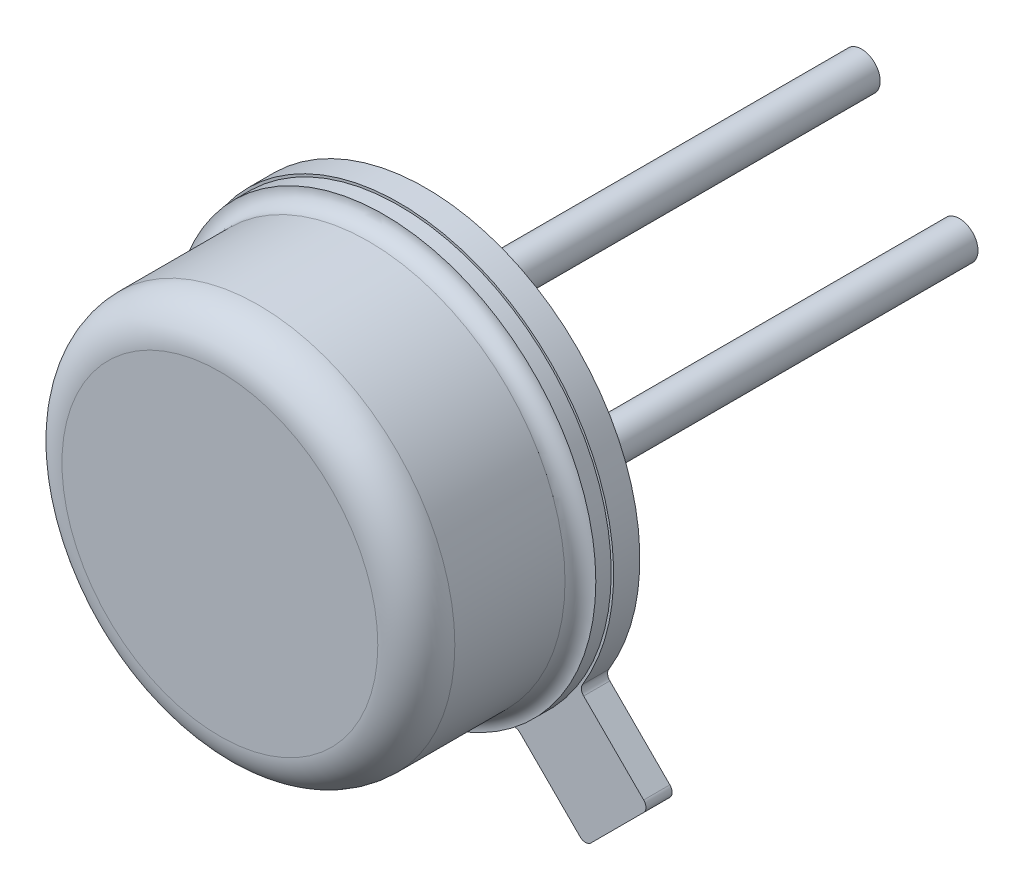
ISO-10303-21;
HEADER;
FILE_DESCRIPTION(('STEP AP214'),'2;1');
FILE_NAME('part.step','',(''),(''),'','','');
FILE_SCHEMA(('AUTOMOTIVE_DESIGN { 1 0 10303 214 1 1 1 1 }'));
ENDSEC;
DATA;
#1=APPLICATION_CONTEXT('core data for automotive mechanical design processes');
#2=APPLICATION_PROTOCOL_DEFINITION('international standard','automotive_design',2000,#1);
#3=PRODUCT_CONTEXT('',#1,'mechanical');
#4=PRODUCT('Part','Part','',(#3));
#5=PRODUCT_RELATED_PRODUCT_CATEGORY('part','',(#4));
#6=PRODUCT_DEFINITION_FORMATION('','',#4);
#7=PRODUCT_DEFINITION_CONTEXT('part definition',#1,'design');
#8=PRODUCT_DEFINITION('design','',#6,#7);
#9=PRODUCT_DEFINITION_SHAPE('','',#8);
#10=(LENGTH_UNIT() NAMED_UNIT(*) SI_UNIT(.MILLI.,.METRE.));
#11=(NAMED_UNIT(*) PLANE_ANGLE_UNIT() SI_UNIT($,.RADIAN.));
#12=(NAMED_UNIT(*) SI_UNIT($,.STERADIAN.) SOLID_ANGLE_UNIT());
#13=UNCERTAINTY_MEASURE_WITH_UNIT(LENGTH_MEASURE(1.E-05),#10,'distance_accuracy_value','');
#14=(GEOMETRIC_REPRESENTATION_CONTEXT(3) GLOBAL_UNCERTAINTY_ASSIGNED_CONTEXT((#13)) GLOBAL_UNIT_ASSIGNED_CONTEXT((#10,
#11,#12)) REPRESENTATION_CONTEXT('',''));
#15=CARTESIAN_POINT('',(0.,0.,0.));
#16=DIRECTION('',(0.,0.,1.));
#17=DIRECTION('',(1.,0.,0.));
#18=AXIS2_PLACEMENT_3D('',#15,#16,#17);
#19=CARTESIAN_POINT('',(97.9756187844857,60.7265618104389,0.34));
#20=DIRECTION('',(0.,0.,1.));
#21=DIRECTION('',(1.,0.,0.));
#22=AXIS2_PLACEMENT_3D('',#19,#20,#21);
#23=PLANE('',#22);
#24=CARTESIAN_POINT('',(96.7056187844857,60.7265618104389,0.34));
#25=DIRECTION('',(0.,0.,1.));
#26=DIRECTION('',(1.,0.,0.));
#27=AXIS2_PLACEMENT_3D('',#24,#25,#26);
#28=CIRCLE('',#27,0.241500000000006);
#29=CARTESIAN_POINT('',(96.9471187844857,60.7265618104389,0.34));
#30=VERTEX_POINT('',#29);
#31=EDGE_CURVE('E368',#30,#30,#28,.T.);
#32=ORIENTED_EDGE('',*,*,#31,.F.);
#33=EDGE_LOOP('',(#32));
#34=FACE_BOUND('',#33,.T.);
#35=CARTESIAN_POINT('',(96.7056187844857,60.7265618104389,0.34));
#36=DIRECTION('',(0.,0.,1.));
#37=DIRECTION('',(1.,0.,0.));
#38=AXIS2_PLACEMENT_3D('',#35,#36,#37);
#39=CIRCLE('',#38,0.241000000000008);
#40=CARTESIAN_POINT('',(96.9466187844857,60.7265618104389,0.34));
#41=VERTEX_POINT('',#40);
#42=EDGE_CURVE('E11',#41,#41,#39,.F.);
#43=ORIENTED_EDGE('',*,*,#42,.F.);
#44=EDGE_LOOP('',(#43));
#45=FACE_BOUND('',#44,.T.);
#46=ADVANCED_FACE('F32',(#34,#45),#23,.F.);
#47=CARTESIAN_POINT('',(97.9756187844857,61.9965618104389,0.34));
#48=DIRECTION('',(0.,0.,1.));
#49=DIRECTION('',(1.,0.,0.));
#50=AXIS2_PLACEMENT_3D('',#47,#48,#49);
#51=CIRCLE('',#50,0.241500000000006);
#52=CARTESIAN_POINT('',(98.2171187844857,61.9965618104389,0.34));
#53=VERTEX_POINT('',#52);
#54=EDGE_CURVE('E376',#53,#53,#51,.T.);
#55=ORIENTED_EDGE('',*,*,#54,.F.);
#56=EDGE_LOOP('',(#55));
#57=FACE_BOUND('',#56,.T.);
#58=CARTESIAN_POINT('',(97.9756187844857,61.9965618104389,0.34));
#59=DIRECTION('',(0.,0.,1.));
#60=DIRECTION('',(1.,0.,0.));
#61=AXIS2_PLACEMENT_3D('',#58,#59,#60);
#62=CIRCLE('',#61,0.241000000000008);
#63=CARTESIAN_POINT('',(98.2166187844857,61.9965618104389,0.34));
#64=VERTEX_POINT('',#63);
#65=EDGE_CURVE('E41',#64,#64,#62,.F.);
#66=ORIENTED_EDGE('',*,*,#65,.F.);
#67=EDGE_LOOP('',(#66));
#68=FACE_BOUND('',#67,.T.);
#69=ADVANCED_FACE('F177',(#57,#68),#23,.F.);
#70=CARTESIAN_POINT('',(99.2456187844857,60.7265618104389,0.34));
#71=DIRECTION('',(0.,0.,1.));
#72=DIRECTION('',(1.,0.,0.));
#73=AXIS2_PLACEMENT_3D('',#70,#71,#72);
#74=CIRCLE('',#73,0.241500000000006);
#75=CARTESIAN_POINT('',(99.4871187844857,60.7265618104389,0.34));
#76=VERTEX_POINT('',#75);
#77=EDGE_CURVE('E373',#76,#76,#74,.T.);
#78=ORIENTED_EDGE('',*,*,#77,.F.);
#79=EDGE_LOOP('',(#78));
#80=FACE_BOUND('',#79,.T.);
#81=CARTESIAN_POINT('',(99.2456187844857,60.7265618104389,0.34));
#82=DIRECTION('',(0.,0.,1.));
#83=DIRECTION('',(1.,0.,0.));
#84=AXIS2_PLACEMENT_3D('',#81,#82,#83);
#85=CIRCLE('',#84,0.241000000000008);
#86=CARTESIAN_POINT('',(99.4866187844857,60.7265618104389,0.34));
#87=VERTEX_POINT('',#86);
#88=EDGE_CURVE('E170',#87,#87,#85,.F.);
#89=ORIENTED_EDGE('',*,*,#88,.F.);
#90=EDGE_LOOP('',(#89));
#91=FACE_BOUND('',#90,.T.);
#92=ADVANCED_FACE('F179',(#80,#91),#23,.F.);
#93=CARTESIAN_POINT('',(100.438570889083,59.2309317825046,0.34));
#94=DIRECTION('',(0.,0.,1.));
#95=DIRECTION('',(1.,0.,0.));
#96=AXIS2_PLACEMENT_3D('',#93,#94,#95);
#97=PLANE('',#96);
#98=CARTESIAN_POINT('',(100.438570889083,59.2309317825046,0.34));
#99=DIRECTION('',(0.,0.,-1.));
#100=DIRECTION('',(1.,0.,0.));
#101=AXIS2_PLACEMENT_3D('',#98,#99,#100);
#102=CIRCLE('',#101,0.0999999999999641);
#103=CARTESIAN_POINT('',(100.367860210965,59.160221104386,0.34));
#104=VERTEX_POINT('',#103);
#105=CARTESIAN_POINT('',(100.353096236833,59.2828363470693,0.34));
#106=VERTEX_POINT('',#105);
#107=EDGE_CURVE('E146',#104,#106,#102,.T.);
#108=ORIENTED_EDGE('',*,*,#107,.T.);
#109=CARTESIAN_POINT('',(97.9756187844857,60.7265618104389,0.34));
#110=DIRECTION('',(0.,0.,1.));
#111=DIRECTION('',(1.,0.,0.));
#112=AXIS2_PLACEMENT_3D('',#109,#110,#111);
#113=CIRCLE('',#112,2.78149999999999);
#114=CARTESIAN_POINT('',(99.4193442478552,58.3490843580918,0.34));
#115=VERTEX_POINT('',#114);
#116=EDGE_CURVE('E93',#106,#115,#113,.T.);
#117=ORIENTED_EDGE('',*,*,#116,.T.);
#118=CARTESIAN_POINT('',(99.47124881242,58.2636097058414,0.34));
#119=DIRECTION('',(0.,0.,-1.));
#120=DIRECTION('',(1.,0.,0.));
#121=AXIS2_PLACEMENT_3D('',#118,#119,#120);
#122=CIRCLE('',#121,0.0999999999999656);
#123=CARTESIAN_POINT('',(99.5419594905386,58.33432038396,0.34));
#124=VERTEX_POINT('',#123);
#125=EDGE_CURVE('E389',#115,#124,#122,.T.);
#126=ORIENTED_EDGE('',*,*,#125,.T.);
#127=DIRECTION('',(0.707106781186557,-0.707106781186538,0.));
#128=VECTOR('',#127,1.);
#129=CARTESIAN_POINT('',(99.5419594905386,58.33432038396,0.34));
#130=LINE('',#129,#128);
#131=CARTESIAN_POINT('',(100.320738424291,57.5555414502078,0.34));
#132=VERTEX_POINT('',#131);
#133=EDGE_CURVE('E391',#124,#132,#130,.T.);
#134=ORIENTED_EDGE('',*,*,#133,.T.);
#135=CARTESIAN_POINT('',(100.39144910241,57.6262521283264,0.34));
#136=DIRECTION('',(0.,0.,1.));
#137=DIRECTION('',(1.,0.,0.));
#138=AXIS2_PLACEMENT_3D('',#135,#136,#137);
#139=CIRCLE('',#138,0.1);
#140=CARTESIAN_POINT('',(100.462159780528,57.5555414502078,0.34));
#141=VERTEX_POINT('',#140);
#142=EDGE_CURVE('E113',#132,#141,#139,.T.);
#143=ORIENTED_EDGE('',*,*,#142,.T.);
#144=DIRECTION('',(0.707106781186562,0.707106781186533,0.));
#145=VECTOR('',#144,1.);
#146=CARTESIAN_POINT('',(100.462159780528,57.5555414502078,0.34));
#147=LINE('',#146,#145);
#148=CARTESIAN_POINT('',(101.146639144717,58.2400208143964,0.34));
#149=VERTEX_POINT('',#148);
#150=EDGE_CURVE('E106',#141,#149,#147,.T.);
#151=ORIENTED_EDGE('',*,*,#150,.T.);
#152=CARTESIAN_POINT('',(101.075928466598,58.310731492515,0.34));
#153=DIRECTION('',(0.,0.,1.));
#154=DIRECTION('',(1.,0.,0.));
#155=AXIS2_PLACEMENT_3D('',#152,#153,#154);
#156=CIRCLE('',#155,0.100000000000003);
#157=CARTESIAN_POINT('',(101.146639144717,58.3814421706337,0.34));
#158=VERTEX_POINT('',#157);
#159=EDGE_CURVE('E111',#149,#158,#156,.T.);
#160=ORIENTED_EDGE('',*,*,#159,.T.);
#161=DIRECTION('',(-0.707106781186544,0.707106781186551,0.));
#162=VECTOR('',#161,1.);
#163=CARTESIAN_POINT('',(100.367860210965,59.160221104386,0.34));
#164=LINE('',#163,#162);
#165=EDGE_CURVE('E49',#158,#104,#164,.T.);
#166=ORIENTED_EDGE('',*,*,#165,.T.);
#167=EDGE_LOOP('',(#108,#117,#126,#134,#143,#151,#160,#166));
#168=FACE_BOUND('',#167,.T.);
#169=CARTESIAN_POINT('',(97.9756187844857,60.7265618104389,0.34));
#170=DIRECTION('',(0.,0.,1.));
#171=DIRECTION('',(1.,0.,0.));
#172=AXIS2_PLACEMENT_3D('',#169,#170,#171);
#173=CIRCLE('',#172,2.75000000000001);
#174=CARTESIAN_POINT('',(100.725618784486,60.7265618104389,0.34));
#175=VERTEX_POINT('',#174);
#176=EDGE_CURVE('E366',#175,#175,#173,.T.);
#177=ORIENTED_EDGE('',*,*,#176,.F.);
#178=EDGE_LOOP('',(#177));
#179=FACE_BOUND('',#178,.T.);
#180=ADVANCED_FACE('F108',(#168,#179),#97,.T.);
#181=CARTESIAN_POINT('',(100.438570889083,59.2309317825046,0.));
#182=DIRECTION('',(0.,0.,1.));
#183=DIRECTION('',(1.,0.,0.));
#184=AXIS2_PLACEMENT_3D('',#181,#182,#183);
#185=PLANE('',#184);
#186=CARTESIAN_POINT('',(99.2456187844857,60.7265618104389,0.));
#187=DIRECTION('',(0.,0.,1.));
#188=DIRECTION('',(1.,0.,0.));
#189=AXIS2_PLACEMENT_3D('',#186,#187,#188);
#190=CIRCLE('',#189,0.241500000000006);
#191=CARTESIAN_POINT('',(99.4871187844857,60.7265618104389,0.));
#192=VERTEX_POINT('',#191);
#193=EDGE_CURVE('E382',#192,#192,#190,.T.);
#194=ORIENTED_EDGE('',*,*,#193,.T.);
#195=EDGE_LOOP('',(#194));
#196=FACE_BOUND('',#195,.T.);
#197=CARTESIAN_POINT('',(100.438570889083,59.2309317825046,0.));
#198=DIRECTION('',(0.,0.,-1.));
#199=DIRECTION('',(1.,0.,0.));
#200=AXIS2_PLACEMENT_3D('',#197,#198,#199);
#201=CIRCLE('',#200,0.0999999999999641);
#202=CARTESIAN_POINT('',(100.367860210965,59.160221104386,0.));
#203=VERTEX_POINT('',#202);
#204=CARTESIAN_POINT('',(100.353096236833,59.2828363470693,0.));
#205=VERTEX_POINT('',#204);
#206=EDGE_CURVE('E131',#203,#205,#201,.T.);
#207=ORIENTED_EDGE('',*,*,#206,.F.);
#208=DIRECTION('',(-0.707106781186544,0.707106781186551,0.));
#209=VECTOR('',#208,1.);
#210=CARTESIAN_POINT('',(100.367860210965,59.160221104386,0.));
#211=LINE('',#210,#209);
#212=CARTESIAN_POINT('',(101.146639144717,58.3814421706337,0.));
#213=VERTEX_POINT('',#212);
#214=EDGE_CURVE('E84',#213,#203,#211,.T.);
#215=ORIENTED_EDGE('',*,*,#214,.F.);
#216=CARTESIAN_POINT('',(101.075928466598,58.310731492515,0.));
#217=DIRECTION('',(0.,0.,1.));
#218=DIRECTION('',(1.,0.,0.));
#219=AXIS2_PLACEMENT_3D('',#216,#217,#218);
#220=CIRCLE('',#219,0.100000000000003);
#221=CARTESIAN_POINT('',(101.146639144717,58.2400208143964,0.));
#222=VERTEX_POINT('',#221);
#223=EDGE_CURVE('E78',#222,#213,#220,.T.);
#224=ORIENTED_EDGE('',*,*,#223,.F.);
#225=DIRECTION('',(0.707106781186562,0.707106781186533,0.));
#226=VECTOR('',#225,1.);
#227=CARTESIAN_POINT('',(100.462159780528,57.5555414502078,0.));
#228=LINE('',#227,#226);
#229=CARTESIAN_POINT('',(100.462159780528,57.5555414502078,0.));
#230=VERTEX_POINT('',#229);
#231=EDGE_CURVE('E121',#230,#222,#228,.T.);
#232=ORIENTED_EDGE('',*,*,#231,.F.);
#233=CARTESIAN_POINT('',(100.39144910241,57.6262521283264,0.));
#234=DIRECTION('',(0.,0.,1.));
#235=DIRECTION('',(1.,0.,0.));
#236=AXIS2_PLACEMENT_3D('',#233,#234,#235);
#237=CIRCLE('',#236,0.1);
#238=CARTESIAN_POINT('',(100.320738424291,57.5555414502078,0.));
#239=VERTEX_POINT('',#238);
#240=EDGE_CURVE('E141',#239,#230,#237,.T.);
#241=ORIENTED_EDGE('',*,*,#240,.F.);
#242=DIRECTION('',(0.707106781186557,-0.707106781186538,0.));
#243=VECTOR('',#242,1.);
#244=CARTESIAN_POINT('',(99.5419594905386,58.33432038396,0.));
#245=LINE('',#244,#243);
#246=CARTESIAN_POINT('',(99.5419594905386,58.33432038396,0.));
#247=VERTEX_POINT('',#246);
#248=EDGE_CURVE('E139',#247,#239,#245,.T.);
#249=ORIENTED_EDGE('',*,*,#248,.F.);
#250=CARTESIAN_POINT('',(99.47124881242,58.2636097058414,0.));
#251=DIRECTION('',(0.,0.,-1.));
#252=DIRECTION('',(1.,0.,0.));
#253=AXIS2_PLACEMENT_3D('',#250,#251,#252);
#254=CIRCLE('',#253,0.0999999999999656);
#255=CARTESIAN_POINT('',(99.4193442478552,58.3490843580918,0.));
#256=VERTEX_POINT('',#255);
#257=EDGE_CURVE('E137',#256,#247,#254,.T.);
#258=ORIENTED_EDGE('',*,*,#257,.F.);
#259=CARTESIAN_POINT('',(97.9756187844857,60.7265618104389,0.));
#260=DIRECTION('',(0.,0.,1.));
#261=DIRECTION('',(1.,0.,0.));
#262=AXIS2_PLACEMENT_3D('',#259,#260,#261);
#263=CIRCLE('',#262,2.78149999999999);
#264=EDGE_CURVE('E134',#205,#256,#263,.T.);
#265=ORIENTED_EDGE('',*,*,#264,.F.);
#266=EDGE_LOOP('',(#207,#215,#224,#232,#241,#249,#258,#265));
#267=FACE_BOUND('',#266,.T.);
#268=CARTESIAN_POINT('',(97.9756187844857,61.9965618104389,0.));
#269=DIRECTION('',(0.,0.,1.));
#270=DIRECTION('',(1.,0.,0.));
#271=AXIS2_PLACEMENT_3D('',#268,#269,#270);
#272=CIRCLE('',#271,0.241500000000006);
#273=CARTESIAN_POINT('',(98.2171187844857,61.9965618104389,0.));
#274=VERTEX_POINT('',#273);
#275=EDGE_CURVE('E135',#274,#274,#272,.T.);
#276=ORIENTED_EDGE('',*,*,#275,.T.);
#277=EDGE_LOOP('',(#276));
#278=FACE_BOUND('',#277,.T.);
#279=CARTESIAN_POINT('',(96.7056187844857,60.7265618104389,0.));
#280=DIRECTION('',(0.,0.,1.));
#281=DIRECTION('',(1.,0.,0.));
#282=AXIS2_PLACEMENT_3D('',#279,#280,#281);
#283=CIRCLE('',#282,0.241500000000006);
#284=CARTESIAN_POINT('',(96.9471187844857,60.7265618104389,0.));
#285=VERTEX_POINT('',#284);
#286=EDGE_CURVE('E379',#285,#285,#283,.T.);
#287=ORIENTED_EDGE('',*,*,#286,.T.);
#288=EDGE_LOOP('',(#287));
#289=FACE_BOUND('',#288,.T.);
#290=ADVANCED_FACE('F212',(#196,#267,#278,#289),#185,.F.);
#291=CARTESIAN_POINT('',(100.438570889083,59.2309317825046,0.34));
#292=DIRECTION('',(0.,0.,-1.));
#293=DIRECTION('',(-1.,0.,0.));
#294=AXIS2_PLACEMENT_3D('',#291,#292,#293);
#295=CYLINDRICAL_SURFACE('',#294,0.0999999999999641);
#296=ORIENTED_EDGE('',*,*,#206,.T.);
#297=DIRECTION('',(0.,0.,-1.));
#298=VECTOR('',#297,1.);
#299=CARTESIAN_POINT('',(100.353096236833,59.2828363470693,0.34));
#300=LINE('',#299,#298);
#301=EDGE_CURVE('E159',#106,#205,#300,.T.);
#302=ORIENTED_EDGE('',*,*,#301,.F.);
#303=ORIENTED_EDGE('',*,*,#107,.F.);
#304=DIRECTION('',(0.,0.,-1.));
#305=VECTOR('',#304,1.);
#306=CARTESIAN_POINT('',(100.367860210965,59.160221104386,0.34));
#307=LINE('',#306,#305);
#308=EDGE_CURVE('E127',#104,#203,#307,.T.);
#309=ORIENTED_EDGE('',*,*,#308,.T.);
#310=EDGE_LOOP('',(#296,#302,#303,#309));
#311=FACE_BOUND('',#310,.T.);
#312=ADVANCED_FACE('F215',(#311),#295,.F.);
#313=CARTESIAN_POINT('',(97.9756187844857,60.7265618104389,0.34));
#314=DIRECTION('',(0.,0.,-1.));
#315=DIRECTION('',(-1.,0.,0.));
#316=AXIS2_PLACEMENT_3D('',#313,#314,#315);
#317=CYLINDRICAL_SURFACE('',#316,2.78149999999999);
#318=ORIENTED_EDGE('',*,*,#264,.T.);
#319=DIRECTION('',(0.,0.,-1.));
#320=VECTOR('',#319,1.);
#321=CARTESIAN_POINT('',(99.4193442478552,58.3490843580918,0.34));
#322=LINE('',#321,#320);
#323=EDGE_CURVE('E156',#115,#256,#322,.T.);
#324=ORIENTED_EDGE('',*,*,#323,.F.);
#325=ORIENTED_EDGE('',*,*,#116,.F.);
#326=ORIENTED_EDGE('',*,*,#301,.T.);
#327=EDGE_LOOP('',(#318,#324,#325,#326));
#328=FACE_BOUND('',#327,.T.);
#329=ADVANCED_FACE('F234',(#328),#317,.T.);
#330=CARTESIAN_POINT('',(99.47124881242,58.2636097058414,0.34));
#331=DIRECTION('',(0.,0.,-1.));
#332=DIRECTION('',(-1.,0.,0.));
#333=AXIS2_PLACEMENT_3D('',#330,#331,#332);
#334=CYLINDRICAL_SURFACE('',#333,0.0999999999999656);
#335=ORIENTED_EDGE('',*,*,#257,.T.);
#336=DIRECTION('',(0.,0.,-1.));
#337=VECTOR('',#336,1.);
#338=CARTESIAN_POINT('',(99.5419594905386,58.33432038396,0.34));
#339=LINE('',#338,#337);
#340=EDGE_CURVE('E153',#124,#247,#339,.T.);
#341=ORIENTED_EDGE('',*,*,#340,.F.);
#342=ORIENTED_EDGE('',*,*,#125,.F.);
#343=ORIENTED_EDGE('',*,*,#323,.T.);
#344=EDGE_LOOP('',(#335,#341,#342,#343));
#345=FACE_BOUND('',#344,.T.);
#346=ADVANCED_FACE('F230',(#345),#334,.F.);
#347=CARTESIAN_POINT('',(99.5419594905386,58.33432038396,0.34));
#348=DIRECTION('',(0.707106781186538,0.707106781186557,0.));
#349=DIRECTION('',(-0.707106781186557,0.707106781186538,0.));
#350=AXIS2_PLACEMENT_3D('',#347,#348,#349);
#351=PLANE('',#350);
#352=ORIENTED_EDGE('',*,*,#248,.T.);
#353=DIRECTION('',(0.,0.,-1.));
#354=VECTOR('',#353,1.);
#355=CARTESIAN_POINT('',(100.320738424291,57.5555414502078,0.34));
#356=LINE('',#355,#354);
#357=EDGE_CURVE('E150',#132,#239,#356,.T.);
#358=ORIENTED_EDGE('',*,*,#357,.F.);
#359=ORIENTED_EDGE('',*,*,#133,.F.);
#360=ORIENTED_EDGE('',*,*,#340,.T.);
#361=EDGE_LOOP('',(#352,#358,#359,#360));
#362=FACE_BOUND('',#361,.T.);
#363=ADVANCED_FACE('F226',(#362),#351,.F.);
#364=CARTESIAN_POINT('',(100.39144910241,57.6262521283264,0.34));
#365=DIRECTION('',(0.,0.,-1.));
#366=DIRECTION('',(-1.,0.,0.));
#367=AXIS2_PLACEMENT_3D('',#364,#365,#366);
#368=CYLINDRICAL_SURFACE('',#367,0.1);
#369=ORIENTED_EDGE('',*,*,#240,.T.);
#370=DIRECTION('',(0.,0.,-1.));
#371=VECTOR('',#370,1.);
#372=CARTESIAN_POINT('',(100.462159780528,57.5555414502078,0.34));
#373=LINE('',#372,#371);
#374=EDGE_CURVE('E122',#141,#230,#373,.T.);
#375=ORIENTED_EDGE('',*,*,#374,.F.);
#376=ORIENTED_EDGE('',*,*,#142,.F.);
#377=ORIENTED_EDGE('',*,*,#357,.T.);
#378=EDGE_LOOP('',(#369,#375,#376,#377));
#379=FACE_BOUND('',#378,.T.);
#380=ADVANCED_FACE('F223',(#379),#368,.T.);
#381=CARTESIAN_POINT('',(100.462159780528,57.5555414502078,0.34));
#382=DIRECTION('',(-0.707106781186533,0.707106781186562,0.));
#383=DIRECTION('',(-0.707106781186562,-0.707106781186533,0.));
#384=AXIS2_PLACEMENT_3D('',#381,#382,#383);
#385=PLANE('',#384);
#386=ORIENTED_EDGE('',*,*,#231,.T.);
#387=DIRECTION('',(0.,0.,-1.));
#388=VECTOR('',#387,1.);
#389=CARTESIAN_POINT('',(101.146639144717,58.2400208143964,0.34));
#390=LINE('',#389,#388);
#391=EDGE_CURVE('E118',#149,#222,#390,.T.);
#392=ORIENTED_EDGE('',*,*,#391,.F.);
#393=ORIENTED_EDGE('',*,*,#150,.F.);
#394=ORIENTED_EDGE('',*,*,#374,.T.);
#395=EDGE_LOOP('',(#386,#392,#393,#394));
#396=FACE_BOUND('',#395,.T.);
#397=ADVANCED_FACE('F119',(#396),#385,.F.);
#398=CARTESIAN_POINT('',(101.075928466598,58.310731492515,0.34));
#399=DIRECTION('',(0.,0.,-1.));
#400=DIRECTION('',(-1.,0.,0.));
#401=AXIS2_PLACEMENT_3D('',#398,#399,#400);
#402=CYLINDRICAL_SURFACE('',#401,0.100000000000003);
#403=ORIENTED_EDGE('',*,*,#223,.T.);
#404=DIRECTION('',(0.,0.,-1.));
#405=VECTOR('',#404,1.);
#406=CARTESIAN_POINT('',(101.146639144717,58.3814421706337,0.34));
#407=LINE('',#406,#405);
#408=EDGE_CURVE('E123',#158,#213,#407,.T.);
#409=ORIENTED_EDGE('',*,*,#408,.F.);
#410=ORIENTED_EDGE('',*,*,#159,.F.);
#411=ORIENTED_EDGE('',*,*,#391,.T.);
#412=EDGE_LOOP('',(#403,#409,#410,#411));
#413=FACE_BOUND('',#412,.T.);
#414=ADVANCED_FACE('F125',(#413),#402,.T.);
#415=CARTESIAN_POINT('',(100.367860210965,59.160221104386,0.34));
#416=DIRECTION('',(-0.707106781186551,-0.707106781186544,0.));
#417=DIRECTION('',(0.707106781186544,-0.707106781186551,0.));
#418=AXIS2_PLACEMENT_3D('',#415,#416,#417);
#419=PLANE('',#418);
#420=ORIENTED_EDGE('',*,*,#214,.T.);
#421=ORIENTED_EDGE('',*,*,#308,.F.);
#422=ORIENTED_EDGE('',*,*,#165,.F.);
#423=ORIENTED_EDGE('',*,*,#408,.T.);
#424=EDGE_LOOP('',(#420,#421,#422,#423));
#425=FACE_BOUND('',#424,.T.);
#426=ADVANCED_FACE('F208',(#425),#419,.F.);
#427=CARTESIAN_POINT('',(97.9756187844857,61.9965618104389,0.34));
#428=DIRECTION('',(0.,0.,-1.));
#429=DIRECTION('',(-1.,0.,0.));
#430=AXIS2_PLACEMENT_3D('',#427,#428,#429);
#431=CYLINDRICAL_SURFACE('',#430,0.241500000000006);
#432=ORIENTED_EDGE('',*,*,#54,.T.);
#433=EDGE_LOOP('',(#432));
#434=FACE_BOUND('',#433,.T.);
#435=ORIENTED_EDGE('',*,*,#275,.F.);
#436=EDGE_LOOP('',(#435));
#437=FACE_BOUND('',#436,.T.);
#438=ADVANCED_FACE('F204',(#434,#437),#431,.F.);
#439=CARTESIAN_POINT('',(99.2456187844857,60.7265618104389,0.34));
#440=DIRECTION('',(0.,0.,-1.));
#441=DIRECTION('',(-1.,0.,0.));
#442=AXIS2_PLACEMENT_3D('',#439,#440,#441);
#443=CYLINDRICAL_SURFACE('',#442,0.241500000000006);
#444=ORIENTED_EDGE('',*,*,#77,.T.);
#445=EDGE_LOOP('',(#444));
#446=FACE_BOUND('',#445,.T.);
#447=ORIENTED_EDGE('',*,*,#193,.F.);
#448=EDGE_LOOP('',(#447));
#449=FACE_BOUND('',#448,.T.);
#450=ADVANCED_FACE('F200',(#446,#449),#443,.F.);
#451=CARTESIAN_POINT('',(96.7056187844857,60.7265618104389,0.34));
#452=DIRECTION('',(0.,0.,-1.));
#453=DIRECTION('',(-1.,0.,0.));
#454=AXIS2_PLACEMENT_3D('',#451,#452,#453);
#455=CYLINDRICAL_SURFACE('',#454,0.241500000000006);
#456=ORIENTED_EDGE('',*,*,#31,.T.);
#457=EDGE_LOOP('',(#456));
#458=FACE_BOUND('',#457,.T.);
#459=ORIENTED_EDGE('',*,*,#286,.F.);
#460=EDGE_LOOP('',(#459));
#461=FACE_BOUND('',#460,.T.);
#462=ADVANCED_FACE('F196',(#458,#461),#455,.F.);
#463=CARTESIAN_POINT('',(97.9756187844857,60.7265618104389,0.54));
#464=DIRECTION('',(0.,0.,-1.));
#465=DIRECTION('',(-1.,0.,0.));
#466=AXIS2_PLACEMENT_3D('',#463,#464,#465);
#467=CYLINDRICAL_SURFACE('',#466,2.75000000000001);
#468=CARTESIAN_POINT('',(97.9756187844857,60.7265618104389,0.54));
#469=DIRECTION('',(0.,0.,1.));
#470=DIRECTION('',(1.,0.,0.));
#471=AXIS2_PLACEMENT_3D('',#468,#469,#470);
#472=CIRCLE('',#471,2.75000000000001);
#473=CARTESIAN_POINT('',(100.725618784486,60.7265618104389,0.54));
#474=VERTEX_POINT('',#473);
#475=EDGE_CURVE('E254',#474,#474,#472,.T.);
#476=ORIENTED_EDGE('',*,*,#475,.F.);
#477=EDGE_LOOP('',(#476));
#478=FACE_BOUND('',#477,.T.);
#479=ORIENTED_EDGE('',*,*,#176,.T.);
#480=EDGE_LOOP('',(#479));
#481=FACE_BOUND('',#480,.T.);
#482=ADVANCED_FACE('F193',(#478,#481),#467,.T.);
#483=CARTESIAN_POINT('',(97.9756187844857,60.7265618104389,2.67));
#484=DIRECTION('',(0.,0.,-1.));
#485=DIRECTION('',(-1.,0.,0.));
#486=AXIS2_PLACEMENT_3D('',#483,#484,#485);
#487=CYLINDRICAL_SURFACE('',#486,2.55000000000001);
#488=CARTESIAN_POINT('',(97.9756187844857,60.7265618104389,2.17));
#489=DIRECTION('',(0.,0.,1.));
#490=DIRECTION('',(1.,0.,0.));
#491=AXIS2_PLACEMENT_3D('',#488,#489,#490);
#492=CIRCLE('',#491,2.55000000000001);
#493=CARTESIAN_POINT('',(100.525618784486,60.7265618104389,2.17));
#494=VERTEX_POINT('',#493);
#495=EDGE_CURVE('E167',#494,#494,#492,.F.);
#496=ORIENTED_EDGE('',*,*,#495,.T.);
#497=EDGE_LOOP('',(#496));
#498=FACE_BOUND('',#497,.T.);
#499=CARTESIAN_POINT('',(97.9756187844857,60.7265618104389,0.74));
#500=DIRECTION('',(0.,0.,1.));
#501=DIRECTION('',(1.,0.,0.));
#502=AXIS2_PLACEMENT_3D('',#499,#500,#501);
#503=CIRCLE('',#502,2.55000000000001);
#504=CARTESIAN_POINT('',(100.525618784486,60.7265618104389,0.74));
#505=VERTEX_POINT('',#504);
#506=EDGE_CURVE('E161',#505,#505,#503,.T.);
#507=ORIENTED_EDGE('',*,*,#506,.T.);
#508=EDGE_LOOP('',(#507));
#509=FACE_BOUND('',#508,.T.);
#510=ADVANCED_FACE('F191',(#498,#509),#487,.T.);
#511=CARTESIAN_POINT('',(97.9756187844857,60.7265618104389,2.67));
#512=DIRECTION('',(0.,0.,1.));
#513=DIRECTION('',(1.,0.,0.));
#514=AXIS2_PLACEMENT_3D('',#511,#512,#513);
#515=PLANE('',#514);
#516=CARTESIAN_POINT('',(97.9756187844857,60.7265618104389,2.67));
#517=DIRECTION('',(0.,0.,1.));
#518=DIRECTION('',(1.,0.,0.));
#519=AXIS2_PLACEMENT_3D('',#516,#517,#518);
#520=CIRCLE('',#519,2.05000000000001);
#521=CARTESIAN_POINT('',(100.025618784486,60.7265618104389,2.67));
#522=VERTEX_POINT('',#521);
#523=EDGE_CURVE('E164',#522,#522,#520,.T.);
#524=ORIENTED_EDGE('',*,*,#523,.T.);
#525=EDGE_LOOP('',(#524));
#526=FACE_BOUND('',#525,.T.);
#527=ADVANCED_FACE('F242',(#526),#515,.T.);
#528=CARTESIAN_POINT('',(97.9756187844857,60.7265618104389,0.74));
#529=DIRECTION('',(0.,0.,1.));
#530=DIRECTION('',(1.,0.,0.));
#531=AXIS2_PLACEMENT_3D('',#528,#529,#530);
#532=TOROIDAL_SURFACE('',#531,2.75000000000001,0.2);
#533=ORIENTED_EDGE('',*,*,#475,.T.);
#534=EDGE_LOOP('',(#533));
#535=FACE_BOUND('',#534,.T.);
#536=ORIENTED_EDGE('',*,*,#506,.F.);
#537=EDGE_LOOP('',(#536));
#538=FACE_BOUND('',#537,.T.);
#539=ADVANCED_FACE('F240',(#535,#538),#532,.F.);
#540=CARTESIAN_POINT('',(97.9756187844857,60.7265618104389,2.17));
#541=DIRECTION('',(0.,0.,1.));
#542=DIRECTION('',(1.,0.,0.));
#543=AXIS2_PLACEMENT_3D('',#540,#541,#542);
#544=TOROIDAL_SURFACE('',#543,2.05000000000001,0.5);
#545=ORIENTED_EDGE('',*,*,#495,.F.);
#546=EDGE_LOOP('',(#545));
#547=FACE_BOUND('',#546,.T.);
#548=ORIENTED_EDGE('',*,*,#523,.F.);
#549=EDGE_LOOP('',(#548));
#550=FACE_BOUND('',#549,.T.);
#551=ADVANCED_FACE('F34',(#547,#550),#544,.T.);
#552=CARTESIAN_POINT('',(99.2456187844857,60.7265618104389,-5.66));
#553=DIRECTION('',(0.,0.,1.));
#554=DIRECTION('',(1.,0.,0.));
#555=AXIS2_PLACEMENT_3D('',#552,#553,#554);
#556=CYLINDRICAL_SURFACE('',#555,0.241000000000008);
#557=CARTESIAN_POINT('',(99.2456187844857,60.7265618104389,-5.66));
#558=DIRECTION('',(0.,0.,-1.));
#559=DIRECTION('',(-1.,0.,0.));
#560=AXIS2_PLACEMENT_3D('',#557,#558,#559);
#561=CIRCLE('',#560,0.241000000000008);
#562=CARTESIAN_POINT('',(99.0046187844857,60.7265618104389,-5.66));
#563=VERTEX_POINT('',#562);
#564=EDGE_CURVE('E361',#563,#563,#561,.T.);
#565=ORIENTED_EDGE('',*,*,#564,.F.);
#566=EDGE_LOOP('',(#565));
#567=FACE_BOUND('',#566,.T.);
#568=ORIENTED_EDGE('',*,*,#88,.T.);
#569=EDGE_LOOP('',(#568));
#570=FACE_BOUND('',#569,.T.);
#571=ADVANCED_FACE('F248',(#567,#570),#556,.T.);
#572=CARTESIAN_POINT('',(99.2456187844857,60.7265618104389,-5.66));
#573=DIRECTION('',(0.,0.,-1.));
#574=DIRECTION('',(-1.,0.,0.));
#575=AXIS2_PLACEMENT_3D('',#572,#573,#574);
#576=PLANE('',#575);
#577=ORIENTED_EDGE('',*,*,#564,.T.);
#578=EDGE_LOOP('',(#577));
#579=FACE_BOUND('',#578,.T.);
#580=ADVANCED_FACE('F302',(#579),#576,.T.);
#581=CARTESIAN_POINT('',(97.9756187844857,61.9965618104389,-5.66));
#582=DIRECTION('',(0.,0.,1.));
#583=DIRECTION('',(1.,0.,0.));
#584=AXIS2_PLACEMENT_3D('',#581,#582,#583);
#585=CYLINDRICAL_SURFACE('',#584,0.241000000000008);
#586=CARTESIAN_POINT('',(97.9756187844857,61.9965618104389,-5.66));
#587=DIRECTION('',(0.,0.,-1.));
#588=DIRECTION('',(-1.,0.,0.));
#589=AXIS2_PLACEMENT_3D('',#586,#587,#588);
#590=CIRCLE('',#589,0.241000000000008);
#591=CARTESIAN_POINT('',(97.7346187844857,61.9965618104389,-5.66));
#592=VERTEX_POINT('',#591);
#593=EDGE_CURVE('E358',#592,#592,#590,.T.);
#594=ORIENTED_EDGE('',*,*,#593,.F.);
#595=EDGE_LOOP('',(#594));
#596=FACE_BOUND('',#595,.T.);
#597=ORIENTED_EDGE('',*,*,#65,.T.);
#598=EDGE_LOOP('',(#597));
#599=FACE_BOUND('',#598,.T.);
#600=ADVANCED_FACE('F175',(#596,#599),#585,.T.);
#601=CARTESIAN_POINT('',(97.9756187844857,61.9965618104389,-5.66));
#602=DIRECTION('',(0.,0.,-1.));
#603=DIRECTION('',(-1.,0.,0.));
#604=AXIS2_PLACEMENT_3D('',#601,#602,#603);
#605=PLANE('',#604);
#606=ORIENTED_EDGE('',*,*,#593,.T.);
#607=EDGE_LOOP('',(#606));
#608=FACE_BOUND('',#607,.T.);
#609=ADVANCED_FACE('F321',(#608),#605,.T.);
#610=CARTESIAN_POINT('',(96.7056187844857,60.7265618104389,-5.66));
#611=DIRECTION('',(0.,0.,1.));
#612=DIRECTION('',(1.,0.,0.));
#613=AXIS2_PLACEMENT_3D('',#610,#611,#612);
#614=CYLINDRICAL_SURFACE('',#613,0.241000000000008);
#615=CARTESIAN_POINT('',(96.7056187844857,60.7265618104389,-5.66));
#616=DIRECTION('',(0.,0.,-1.));
#617=DIRECTION('',(-1.,0.,0.));
#618=AXIS2_PLACEMENT_3D('',#615,#616,#617);
#619=CIRCLE('',#618,0.241000000000008);
#620=CARTESIAN_POINT('',(96.4646187844857,60.7265618104389,-5.66));
#621=VERTEX_POINT('',#620);
#622=EDGE_CURVE('E357',#621,#621,#619,.T.);
#623=ORIENTED_EDGE('',*,*,#622,.F.);
#624=EDGE_LOOP('',(#623));
#625=FACE_BOUND('',#624,.T.);
#626=ORIENTED_EDGE('',*,*,#42,.T.);
#627=EDGE_LOOP('',(#626));
#628=FACE_BOUND('',#627,.T.);
#629=ADVANCED_FACE('F331',(#625,#628),#614,.T.);
#630=CARTESIAN_POINT('',(96.7056187844857,60.7265618104389,-5.66));
#631=DIRECTION('',(0.,0.,-1.));
#632=DIRECTION('',(-1.,0.,0.));
#633=AXIS2_PLACEMENT_3D('',#630,#631,#632);
#634=PLANE('',#633);
#635=ORIENTED_EDGE('',*,*,#622,.T.);
#636=EDGE_LOOP('',(#635));
#637=FACE_BOUND('',#636,.T.);
#638=ADVANCED_FACE('F341',(#637),#634,.T.);
#639=CLOSED_SHELL('',(#46,#69,#92,#180,#290,#312,#329,#346,#363,#380,#397,#414,#426,#438,#450,
#462,#482,#510,#527,#539,#551,#571,#580,#600,#609,#629,#638));
#640=MANIFOLD_SOLID_BREP('B2',#639);
#641=ADVANCED_BREP_SHAPE_REPRESENTATION('',(#18,#640),#14);
#642=SHAPE_DEFINITION_REPRESENTATION(#9,#641);
ENDSEC;
END-ISO-10303-21;
